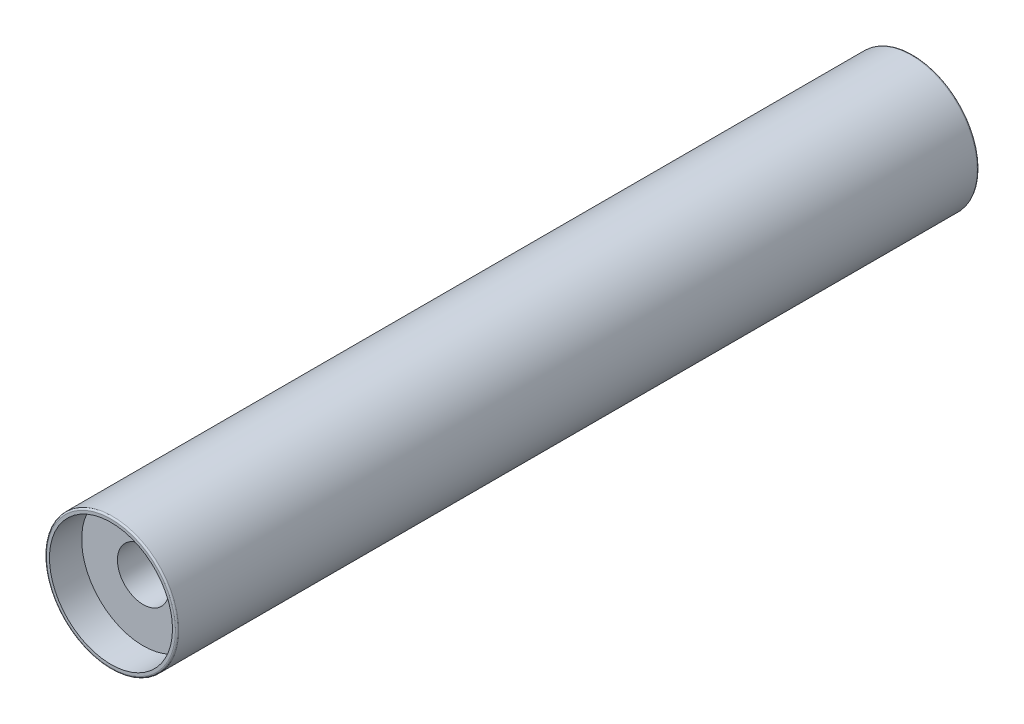
ISO-10303-21;
HEADER;
FILE_DESCRIPTION(('STEP AP214'),'2;1');
FILE_NAME('part.step','',(''),(''),'','','');
FILE_SCHEMA(('AUTOMOTIVE_DESIGN { 1 0 10303 214 1 1 1 1 }'));
ENDSEC;
DATA;
#1=APPLICATION_CONTEXT('core data for automotive mechanical design processes');
#2=APPLICATION_PROTOCOL_DEFINITION('international standard','automotive_design',2000,#1);
#3=PRODUCT_CONTEXT('',#1,'mechanical');
#4=PRODUCT('Part','Part','',(#3));
#5=PRODUCT_RELATED_PRODUCT_CATEGORY('part','',(#4));
#6=PRODUCT_DEFINITION_FORMATION('','',#4);
#7=PRODUCT_DEFINITION_CONTEXT('part definition',#1,'design');
#8=PRODUCT_DEFINITION('design','',#6,#7);
#9=PRODUCT_DEFINITION_SHAPE('','',#8);
#10=(LENGTH_UNIT() NAMED_UNIT(*) SI_UNIT(.MILLI.,.METRE.));
#11=(NAMED_UNIT(*) PLANE_ANGLE_UNIT() SI_UNIT($,.RADIAN.));
#12=(NAMED_UNIT(*) SI_UNIT($,.STERADIAN.) SOLID_ANGLE_UNIT());
#13=UNCERTAINTY_MEASURE_WITH_UNIT(LENGTH_MEASURE(1.E-05),#10,'distance_accuracy_value','');
#14=(GEOMETRIC_REPRESENTATION_CONTEXT(3) GLOBAL_UNCERTAINTY_ASSIGNED_CONTEXT((#13)) GLOBAL_UNIT_ASSIGNED_CONTEXT((#10,
#11,#12)) REPRESENTATION_CONTEXT('',''));
#15=CARTESIAN_POINT('',(0.,0.,0.));
#16=DIRECTION('',(0.,0.,1.));
#17=DIRECTION('',(1.,0.,0.));
#18=AXIS2_PLACEMENT_3D('',#15,#16,#17);
#19=CARTESIAN_POINT('',(0.,0.,-62.2325));
#20=DIRECTION('',(0.,0.,1.));
#21=DIRECTION('',(1.,0.,0.));
#22=AXIS2_PLACEMENT_3D('',#19,#20,#21);
#23=CYLINDRICAL_SURFACE('',#22,4.);
#24=CARTESIAN_POINT('',(0.,0.,-46.95));
#25=DIRECTION('',(0.,0.,1.));
#26=DIRECTION('',(1.,0.,0.));
#27=AXIS2_PLACEMENT_3D('',#24,#25,#26);
#28=CIRCLE('',#27,4.);
#29=CARTESIAN_POINT('',(4.,0.,-46.95));
#30=VERTEX_POINT('',#29);
#31=EDGE_CURVE('E49',#30,#30,#28,.T.);
#32=ORIENTED_EDGE('',*,*,#31,.T.);
#33=EDGE_LOOP('',(#32));
#34=FACE_BOUND('',#33,.T.);
#35=CARTESIAN_POINT('',(0.,0.,-57.2325));
#36=DIRECTION('',(0.,0.,-1.));
#37=DIRECTION('',(-1.,0.,0.));
#38=AXIS2_PLACEMENT_3D('',#35,#36,#37);
#39=CIRCLE('',#38,4.);
#40=CARTESIAN_POINT('',(-4.,0.,-57.2325));
#41=VERTEX_POINT('',#40);
#42=EDGE_CURVE('E35',#41,#41,#39,.F.);
#43=ORIENTED_EDGE('',*,*,#42,.F.);
#44=EDGE_LOOP('',(#43));
#45=FACE_BOUND('',#44,.T.);
#46=ADVANCED_FACE('F31',(#34,#45),#23,.F.);
#47=CARTESIAN_POINT('',(0.,0.,46.95));
#48=DIRECTION('',(0.,0.,1.));
#49=DIRECTION('',(1.,0.,0.));
#50=AXIS2_PLACEMENT_3D('',#47,#48,#49);
#51=CIRCLE('',#50,4.);
#52=CARTESIAN_POINT('',(4.,0.,46.95));
#53=VERTEX_POINT('',#52);
#54=EDGE_CURVE('E54',#53,#53,#51,.T.);
#55=ORIENTED_EDGE('',*,*,#54,.F.);
#56=EDGE_LOOP('',(#55));
#57=FACE_BOUND('',#56,.T.);
#58=CARTESIAN_POINT('',(0.,0.,57.2325));
#59=DIRECTION('',(0.,0.,1.));
#60=DIRECTION('',(1.,0.,0.));
#61=AXIS2_PLACEMENT_3D('',#58,#59,#60);
#62=CIRCLE('',#61,4.);
#63=CARTESIAN_POINT('',(4.,0.,57.2325));
#64=VERTEX_POINT('',#63);
#65=EDGE_CURVE('E47',#64,#64,#62,.F.);
#66=ORIENTED_EDGE('',*,*,#65,.F.);
#67=EDGE_LOOP('',(#66));
#68=FACE_BOUND('',#67,.T.);
#69=ADVANCED_FACE('F95',(#57,#68),#23,.F.);
#70=CARTESIAN_POINT('',(0.,0.,73.8907683632075));
#71=DIRECTION('',(0.,0.,-1.));
#72=DIRECTION('',(-1.,0.,0.));
#73=AXIS2_PLACEMENT_3D('',#70,#71,#72);
#74=CYLINDRICAL_SURFACE('',#73,9.525);
#75=CARTESIAN_POINT('',(0.,0.,46.95));
#76=DIRECTION('',(0.,0.,1.));
#77=DIRECTION('',(1.,0.,0.));
#78=AXIS2_PLACEMENT_3D('',#75,#76,#77);
#79=CIRCLE('',#78,9.525);
#80=CARTESIAN_POINT('',(9.525,0.,46.95));
#81=VERTEX_POINT('',#80);
#82=EDGE_CURVE('E72',#81,#81,#79,.T.);
#83=ORIENTED_EDGE('',*,*,#82,.T.);
#84=EDGE_LOOP('',(#83));
#85=FACE_BOUND('',#84,.T.);
#86=CARTESIAN_POINT('',(0.,0.,-46.95));
#87=DIRECTION('',(0.,0.,1.));
#88=DIRECTION('',(1.,0.,0.));
#89=AXIS2_PLACEMENT_3D('',#86,#87,#88);
#90=CIRCLE('',#89,9.525);
#91=CARTESIAN_POINT('',(9.525,0.,-46.95));
#92=VERTEX_POINT('',#91);
#93=EDGE_CURVE('E69',#92,#92,#90,.F.);
#94=ORIENTED_EDGE('',*,*,#93,.T.);
#95=EDGE_LOOP('',(#94));
#96=FACE_BOUND('',#95,.T.);
#97=ADVANCED_FACE('F101',(#85,#96),#74,.F.);
#98=CARTESIAN_POINT('',(0.,0.,46.95));
#99=DIRECTION('',(0.,0.,1.));
#100=DIRECTION('',(1.,0.,0.));
#101=AXIS2_PLACEMENT_3D('',#98,#99,#100);
#102=PLANE('',#101);
#103=ORIENTED_EDGE('',*,*,#54,.T.);
#104=EDGE_LOOP('',(#103));
#105=FACE_BOUND('',#104,.T.);
#106=ORIENTED_EDGE('',*,*,#82,.F.);
#107=EDGE_LOOP('',(#106));
#108=FACE_BOUND('',#107,.T.);
#109=ADVANCED_FACE('F109',(#105,#108),#102,.F.);
#110=CARTESIAN_POINT('',(0.,0.,-46.95));
#111=DIRECTION('',(0.,0.,1.));
#112=DIRECTION('',(1.,0.,0.));
#113=AXIS2_PLACEMENT_3D('',#110,#111,#112);
#114=PLANE('',#113);
#115=ORIENTED_EDGE('',*,*,#31,.F.);
#116=EDGE_LOOP('',(#115));
#117=FACE_BOUND('',#116,.T.);
#118=ORIENTED_EDGE('',*,*,#93,.F.);
#119=EDGE_LOOP('',(#118));
#120=FACE_BOUND('',#119,.T.);
#121=ADVANCED_FACE('F106',(#117,#120),#114,.T.);
#122=CARTESIAN_POINT('',(0.,0.,91.2238780286485));
#123=DIRECTION('',(0.,0.,-1.));
#124=DIRECTION('',(-1.,0.,0.));
#125=AXIS2_PLACEMENT_3D('',#122,#123,#124);
#126=CYLINDRICAL_SURFACE('',#125,10.25);
#127=CARTESIAN_POINT('',(0.,0.,61.9825));
#128=DIRECTION('',(0.,0.,1.));
#129=DIRECTION('',(1.,0.,0.));
#130=AXIS2_PLACEMENT_3D('',#127,#128,#129);
#131=CIRCLE('',#130,10.25);
#132=CARTESIAN_POINT('',(10.25,0.,61.9825));
#133=VERTEX_POINT('',#132);
#134=EDGE_CURVE('E39',#133,#133,#131,.F.);
#135=ORIENTED_EDGE('',*,*,#134,.T.);
#136=EDGE_LOOP('',(#135));
#137=FACE_BOUND('',#136,.T.);
#138=CARTESIAN_POINT('',(0.,0.,-61.9825));
#139=DIRECTION('',(0.,0.,1.));
#140=DIRECTION('',(1.,0.,0.));
#141=AXIS2_PLACEMENT_3D('',#138,#139,#140);
#142=CIRCLE('',#141,10.25);
#143=CARTESIAN_POINT('',(10.25,0.,-61.9825));
#144=VERTEX_POINT('',#143);
#145=EDGE_CURVE('E44',#144,#144,#142,.T.);
#146=ORIENTED_EDGE('',*,*,#145,.T.);
#147=EDGE_LOOP('',(#146));
#148=FACE_BOUND('',#147,.T.);
#149=ADVANCED_FACE('F80',(#137,#148),#126,.T.);
#150=CARTESIAN_POINT('',(0.,0.,62.2325));
#151=DIRECTION('',(0.,0.,1.));
#152=DIRECTION('',(1.,0.,0.));
#153=AXIS2_PLACEMENT_3D('',#150,#151,#152);
#154=PLANE('',#153);
#155=CARTESIAN_POINT('',(0.,0.,62.2325));
#156=DIRECTION('',(0.,0.,1.));
#157=DIRECTION('',(1.,0.,0.));
#158=AXIS2_PLACEMENT_3D('',#155,#156,#157);
#159=CIRCLE('',#158,9.55);
#160=CARTESIAN_POINT('',(9.55,0.,62.2325));
#161=VERTEX_POINT('',#160);
#162=EDGE_CURVE('E57',#161,#161,#159,.T.);
#163=ORIENTED_EDGE('',*,*,#162,.F.);
#164=EDGE_LOOP('',(#163));
#165=FACE_BOUND('',#164,.T.);
#166=CARTESIAN_POINT('',(0.,0.,62.2325));
#167=DIRECTION('',(0.,0.,1.));
#168=DIRECTION('',(1.,0.,0.));
#169=AXIS2_PLACEMENT_3D('',#166,#167,#168);
#170=CIRCLE('',#169,10.);
#171=CARTESIAN_POINT('',(10.,0.,62.2325));
#172=VERTEX_POINT('',#171);
#173=EDGE_CURVE('E74',#172,#172,#170,.T.);
#174=ORIENTED_EDGE('',*,*,#173,.T.);
#175=EDGE_LOOP('',(#174));
#176=FACE_BOUND('',#175,.T.);
#177=ADVANCED_FACE('F119',(#165,#176),#154,.T.);
#178=CARTESIAN_POINT('',(0.,0.,-62.2325));
#179=DIRECTION('',(0.,0.,1.));
#180=DIRECTION('',(1.,0.,0.));
#181=AXIS2_PLACEMENT_3D('',#178,#179,#180);
#182=PLANE('',#181);
#183=CARTESIAN_POINT('',(0.,0.,-62.2325));
#184=DIRECTION('',(0.,0.,1.));
#185=DIRECTION('',(1.,0.,0.));
#186=AXIS2_PLACEMENT_3D('',#183,#184,#185);
#187=CIRCLE('',#186,9.55);
#188=CARTESIAN_POINT('',(9.55,0.,-62.2325));
#189=VERTEX_POINT('',#188);
#190=EDGE_CURVE('E64',#189,#189,#187,.T.);
#191=ORIENTED_EDGE('',*,*,#190,.T.);
#192=EDGE_LOOP('',(#191));
#193=FACE_BOUND('',#192,.T.);
#194=CARTESIAN_POINT('',(0.,0.,-62.2325));
#195=DIRECTION('',(0.,0.,1.));
#196=DIRECTION('',(1.,0.,0.));
#197=AXIS2_PLACEMENT_3D('',#194,#195,#196);
#198=CIRCLE('',#197,10.);
#199=CARTESIAN_POINT('',(10.,0.,-62.2325));
#200=VERTEX_POINT('',#199);
#201=EDGE_CURVE('E10',#200,#200,#198,.F.);
#202=ORIENTED_EDGE('',*,*,#201,.T.);
#203=EDGE_LOOP('',(#202));
#204=FACE_BOUND('',#203,.T.);
#205=ADVANCED_FACE('F92',(#193,#204),#182,.F.);
#206=CARTESIAN_POINT('',(0.,0.,61.9825));
#207=DIRECTION('',(0.,0.,1.));
#208=DIRECTION('',(1.,0.,0.));
#209=AXIS2_PLACEMENT_3D('',#206,#207,#208);
#210=TOROIDAL_SURFACE('',#209,10.,0.25);
#211=ORIENTED_EDGE('',*,*,#134,.F.);
#212=EDGE_LOOP('',(#211));
#213=FACE_BOUND('',#212,.T.);
#214=ORIENTED_EDGE('',*,*,#173,.F.);
#215=EDGE_LOOP('',(#214));
#216=FACE_BOUND('',#215,.T.);
#217=ADVANCED_FACE('F85',(#213,#216),#210,.T.);
#218=CARTESIAN_POINT('',(0.,0.,-61.9825));
#219=DIRECTION('',(0.,0.,1.));
#220=DIRECTION('',(1.,0.,0.));
#221=AXIS2_PLACEMENT_3D('',#218,#219,#220);
#222=TOROIDAL_SURFACE('',#221,10.,0.25);
#223=ORIENTED_EDGE('',*,*,#145,.F.);
#224=EDGE_LOOP('',(#223));
#225=FACE_BOUND('',#224,.T.);
#226=ORIENTED_EDGE('',*,*,#201,.F.);
#227=EDGE_LOOP('',(#226));
#228=FACE_BOUND('',#227,.T.);
#229=ADVANCED_FACE('F33',(#225,#228),#222,.T.);
#230=CARTESIAN_POINT('',(0.,0.,57.2325));
#231=DIRECTION('',(0.,0.,1.));
#232=DIRECTION('',(1.,0.,0.));
#233=AXIS2_PLACEMENT_3D('',#230,#231,#232);
#234=PLANE('',#233);
#235=CARTESIAN_POINT('',(0.,0.,57.2325));
#236=DIRECTION('',(0.,0.,1.));
#237=DIRECTION('',(1.,0.,0.));
#238=AXIS2_PLACEMENT_3D('',#235,#236,#237);
#239=CIRCLE('',#238,9.55);
#240=CARTESIAN_POINT('',(9.55,0.,57.2325));
#241=VERTEX_POINT('',#240);
#242=EDGE_CURVE('E50',#241,#241,#239,.T.);
#243=ORIENTED_EDGE('',*,*,#242,.T.);
#244=EDGE_LOOP('',(#243));
#245=FACE_BOUND('',#244,.T.);
#246=ORIENTED_EDGE('',*,*,#65,.T.);
#247=EDGE_LOOP('',(#246));
#248=FACE_BOUND('',#247,.T.);
#249=ADVANCED_FACE('F84',(#245,#248),#234,.T.);
#250=CARTESIAN_POINT('',(0.,0.,57.2325));
#251=DIRECTION('',(0.,0.,1.));
#252=DIRECTION('',(1.,0.,0.));
#253=AXIS2_PLACEMENT_3D('',#250,#251,#252);
#254=CYLINDRICAL_SURFACE('',#253,9.55);
#255=ORIENTED_EDGE('',*,*,#242,.F.);
#256=EDGE_LOOP('',(#255));
#257=FACE_BOUND('',#256,.T.);
#258=ORIENTED_EDGE('',*,*,#162,.T.);
#259=EDGE_LOOP('',(#258));
#260=FACE_BOUND('',#259,.T.);
#261=ADVANCED_FACE('F90',(#257,#260),#254,.F.);
#262=CARTESIAN_POINT('',(0.,0.,-57.2325));
#263=DIRECTION('',(0.,0.,-1.));
#264=DIRECTION('',(1.,0.,0.));
#265=AXIS2_PLACEMENT_3D('',#262,#263,#264);
#266=PLANE('',#265);
#267=CARTESIAN_POINT('',(0.,0.,-57.2325));
#268=DIRECTION('',(0.,0.,1.));
#269=DIRECTION('',(1.,0.,0.));
#270=AXIS2_PLACEMENT_3D('',#267,#268,#269);
#271=CIRCLE('',#270,9.55);
#272=CARTESIAN_POINT('',(9.55,0.,-57.2325));
#273=VERTEX_POINT('',#272);
#274=EDGE_CURVE('E150',#273,#273,#271,.T.);
#275=ORIENTED_EDGE('',*,*,#274,.F.);
#276=EDGE_LOOP('',(#275));
#277=FACE_BOUND('',#276,.T.);
#278=ORIENTED_EDGE('',*,*,#42,.T.);
#279=EDGE_LOOP('',(#278));
#280=FACE_BOUND('',#279,.T.);
#281=ADVANCED_FACE('F134',(#277,#280),#266,.T.);
#282=CARTESIAN_POINT('',(0.,0.,-57.2325));
#283=DIRECTION('',(0.,0.,-1.));
#284=DIRECTION('',(-1.,0.,0.));
#285=AXIS2_PLACEMENT_3D('',#282,#283,#284);
#286=CYLINDRICAL_SURFACE('',#285,9.55);
#287=ORIENTED_EDGE('',*,*,#274,.T.);
#288=EDGE_LOOP('',(#287));
#289=FACE_BOUND('',#288,.T.);
#290=ORIENTED_EDGE('',*,*,#190,.F.);
#291=EDGE_LOOP('',(#290));
#292=FACE_BOUND('',#291,.T.);
#293=ADVANCED_FACE('F139',(#289,#292),#286,.F.);
#294=CLOSED_SHELL('',(#46,#69,#97,#109,#121,#149,#177,#205,#217,#229,#249,#261,#281,#293));
#295=MANIFOLD_SOLID_BREP('B2',#294);
#296=ADVANCED_BREP_SHAPE_REPRESENTATION('',(#18,#295),#14);
#297=SHAPE_DEFINITION_REPRESENTATION(#9,#296);
ENDSEC;
END-ISO-10303-21;
